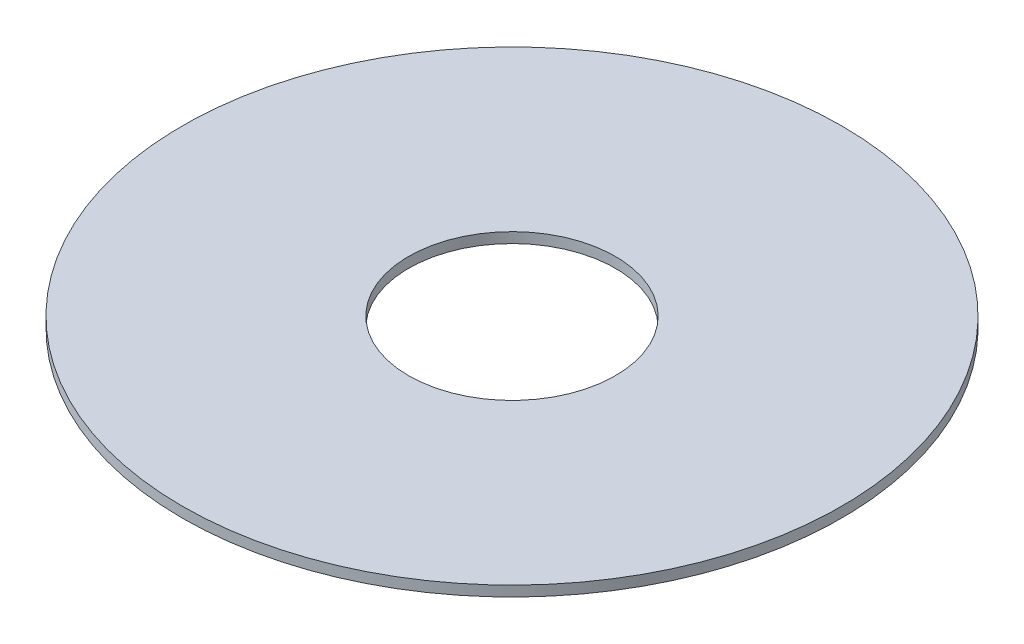
ISO-10303-21;
HEADER;
FILE_DESCRIPTION(('STEP AP214'),'2;1');
FILE_NAME('part.step','',(''),(''),'','','');
FILE_SCHEMA(('AUTOMOTIVE_DESIGN { 1 0 10303 214 1 1 1 1 }'));
ENDSEC;
DATA;
#1=APPLICATION_CONTEXT('core data for automotive mechanical design processes');
#2=APPLICATION_PROTOCOL_DEFINITION('international standard','automotive_design',2000,#1);
#3=PRODUCT_CONTEXT('',#1,'mechanical');
#4=PRODUCT('Part','Part','',(#3));
#5=PRODUCT_RELATED_PRODUCT_CATEGORY('part','',(#4));
#6=PRODUCT_DEFINITION_FORMATION('','',#4);
#7=PRODUCT_DEFINITION_CONTEXT('part definition',#1,'design');
#8=PRODUCT_DEFINITION('design','',#6,#7);
#9=PRODUCT_DEFINITION_SHAPE('','',#8);
#10=(LENGTH_UNIT() NAMED_UNIT(*) SI_UNIT(.MILLI.,.METRE.));
#11=(NAMED_UNIT(*) PLANE_ANGLE_UNIT() SI_UNIT($,.RADIAN.));
#12=(NAMED_UNIT(*) SI_UNIT($,.STERADIAN.) SOLID_ANGLE_UNIT());
#13=UNCERTAINTY_MEASURE_WITH_UNIT(LENGTH_MEASURE(1.E-05),#10,'distance_accuracy_value','');
#14=(GEOMETRIC_REPRESENTATION_CONTEXT(3) GLOBAL_UNCERTAINTY_ASSIGNED_CONTEXT((#13)) GLOBAL_UNIT_ASSIGNED_CONTEXT((#10,
#11,#12)) REPRESENTATION_CONTEXT('',''));
#15=CARTESIAN_POINT('',(0.,0.,0.));
#16=DIRECTION('',(0.,0.,1.));
#17=DIRECTION('',(1.,0.,0.));
#18=AXIS2_PLACEMENT_3D('',#15,#16,#17);
#19=CARTESIAN_POINT('',(0.,2.54,0.));
#20=DIRECTION('',(0.,1.,0.));
#21=DIRECTION('',(0.,0.,1.));
#22=AXIS2_PLACEMENT_3D('',#19,#20,#21);
#23=PLANE('',#22);
#24=CARTESIAN_POINT('',(0.,2.54,0.));
#25=DIRECTION('',(0.,1.,0.));
#26=DIRECTION('',(0.,0.,1.));
#27=AXIS2_PLACEMENT_3D('',#24,#25,#26);
#28=CIRCLE('',#27,80.9625);
#29=CARTESIAN_POINT('',(0.,2.54,80.9625));
#30=VERTEX_POINT('',#29);
#31=EDGE_CURVE('E10',#30,#30,#28,.T.);
#32=ORIENTED_EDGE('',*,*,#31,.T.);
#33=EDGE_LOOP('',(#32));
#34=FACE_BOUND('',#33,.T.);
#35=CARTESIAN_POINT('',(0.,2.54,0.));
#36=DIRECTION('',(0.,1.,0.));
#37=DIRECTION('',(0.,0.,1.));
#38=AXIS2_PLACEMENT_3D('',#35,#36,#37);
#39=CIRCLE('',#38,25.4);
#40=CARTESIAN_POINT('',(0.,2.54,25.4));
#41=VERTEX_POINT('',#40);
#42=EDGE_CURVE('E42',#41,#41,#39,.T.);
#43=ORIENTED_EDGE('',*,*,#42,.F.);
#44=EDGE_LOOP('',(#43));
#45=FACE_BOUND('',#44,.T.);
#46=ADVANCED_FACE('F31',(#34,#45),#23,.T.);
#47=CARTESIAN_POINT('',(0.,0.,0.));
#48=DIRECTION('',(0.,1.,0.));
#49=DIRECTION('',(0.,0.,1.));
#50=AXIS2_PLACEMENT_3D('',#47,#48,#49);
#51=PLANE('',#50);
#52=CARTESIAN_POINT('',(0.,0.,0.));
#53=DIRECTION('',(0.,1.,0.));
#54=DIRECTION('',(0.,0.,1.));
#55=AXIS2_PLACEMENT_3D('',#52,#53,#54);
#56=CIRCLE('',#55,80.9625);
#57=CARTESIAN_POINT('',(0.,0.,80.9625));
#58=VERTEX_POINT('',#57);
#59=EDGE_CURVE('E35',#58,#58,#56,.T.);
#60=ORIENTED_EDGE('',*,*,#59,.F.);
#61=EDGE_LOOP('',(#60));
#62=FACE_BOUND('',#61,.T.);
#63=CARTESIAN_POINT('',(0.,0.,0.));
#64=DIRECTION('',(0.,1.,0.));
#65=DIRECTION('',(0.,0.,1.));
#66=AXIS2_PLACEMENT_3D('',#63,#64,#65);
#67=CIRCLE('',#66,25.4);
#68=CARTESIAN_POINT('',(0.,0.,25.4));
#69=VERTEX_POINT('',#68);
#70=EDGE_CURVE('E44',#69,#69,#67,.T.);
#71=ORIENTED_EDGE('',*,*,#70,.T.);
#72=EDGE_LOOP('',(#71));
#73=FACE_BOUND('',#72,.T.);
#74=ADVANCED_FACE('F54',(#62,#73),#51,.F.);
#75=CARTESIAN_POINT('',(0.,2.54,0.));
#76=DIRECTION('',(0.,-1.,0.));
#77=DIRECTION('',(0.,0.,-1.));
#78=AXIS2_PLACEMENT_3D('',#75,#76,#77);
#79=CYLINDRICAL_SURFACE('',#78,80.9625);
#80=ORIENTED_EDGE('',*,*,#31,.F.);
#81=EDGE_LOOP('',(#80));
#82=FACE_BOUND('',#81,.T.);
#83=ORIENTED_EDGE('',*,*,#59,.T.);
#84=EDGE_LOOP('',(#83));
#85=FACE_BOUND('',#84,.T.);
#86=ADVANCED_FACE('F33',(#82,#85),#79,.T.);
#87=CARTESIAN_POINT('',(0.,2.54,0.));
#88=DIRECTION('',(0.,-1.,0.));
#89=DIRECTION('',(0.,0.,-1.));
#90=AXIS2_PLACEMENT_3D('',#87,#88,#89);
#91=CYLINDRICAL_SURFACE('',#90,25.4);
#92=ORIENTED_EDGE('',*,*,#42,.T.);
#93=EDGE_LOOP('',(#92));
#94=FACE_BOUND('',#93,.T.);
#95=ORIENTED_EDGE('',*,*,#70,.F.);
#96=EDGE_LOOP('',(#95));
#97=FACE_BOUND('',#96,.T.);
#98=ADVANCED_FACE('F50',(#94,#97),#91,.F.);
#99=CLOSED_SHELL('',(#46,#74,#86,#98));
#100=MANIFOLD_SOLID_BREP('B2',#99);
#101=ADVANCED_BREP_SHAPE_REPRESENTATION('',(#18,#100),#14);
#102=SHAPE_DEFINITION_REPRESENTATION(#9,#101);
ENDSEC;
END-ISO-10303-21;
